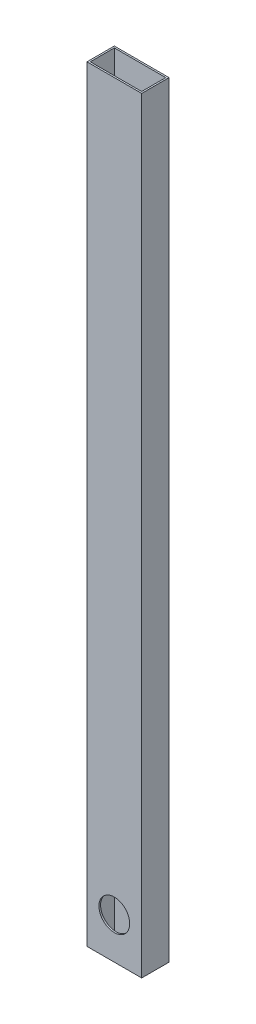
ISO-10303-21;
HEADER;
FILE_DESCRIPTION(('STEP AP214'),'2;1');
FILE_NAME('part.step','',(''),(''),'','','');
FILE_SCHEMA(('AUTOMOTIVE_DESIGN { 1 0 10303 214 1 1 1 1 }'));
ENDSEC;
DATA;
#1=APPLICATION_CONTEXT('core data for automotive mechanical design processes');
#2=APPLICATION_PROTOCOL_DEFINITION('international standard','automotive_design',2000,#1);
#3=PRODUCT_CONTEXT('',#1,'mechanical');
#4=PRODUCT('Part','Part','',(#3));
#5=PRODUCT_RELATED_PRODUCT_CATEGORY('part','',(#4));
#6=PRODUCT_DEFINITION_FORMATION('','',#4);
#7=PRODUCT_DEFINITION_CONTEXT('part definition',#1,'design');
#8=PRODUCT_DEFINITION('design','',#6,#7);
#9=PRODUCT_DEFINITION_SHAPE('','',#8);
#10=(LENGTH_UNIT() NAMED_UNIT(*) SI_UNIT(.MILLI.,.METRE.));
#11=(NAMED_UNIT(*) PLANE_ANGLE_UNIT() SI_UNIT($,.RADIAN.));
#12=(NAMED_UNIT(*) SI_UNIT($,.STERADIAN.) SOLID_ANGLE_UNIT());
#13=UNCERTAINTY_MEASURE_WITH_UNIT(LENGTH_MEASURE(1.E-05),#10,'distance_accuracy_value','');
#14=(GEOMETRIC_REPRESENTATION_CONTEXT(3) GLOBAL_UNCERTAINTY_ASSIGNED_CONTEXT((#13)) GLOBAL_UNIT_ASSIGNED_CONTEXT((#10,
#11,#12)) REPRESENTATION_CONTEXT('',''));
#15=CARTESIAN_POINT('',(0.,0.,0.));
#16=DIRECTION('',(0.,0.,1.));
#17=DIRECTION('',(1.,0.,0.));
#18=AXIS2_PLACEMENT_3D('',#15,#16,#17);
#19=CARTESIAN_POINT('',(0.,711.2,0.));
#20=DIRECTION('',(0.,1.,0.));
#21=DIRECTION('',(0.,0.,1.));
#22=AXIS2_PLACEMENT_3D('',#19,#20,#21);
#23=PLANE('',#22);
#24=DIRECTION('',(0.,0.,-1.));
#25=VECTOR('',#24,1.);
#26=CARTESIAN_POINT('',(0.,711.2,0.));
#27=LINE('',#26,#25);
#28=CARTESIAN_POINT('',(0.,711.2,25.4));
#29=VERTEX_POINT('',#28);
#30=CARTESIAN_POINT('',(0.,711.2,0.));
#31=VERTEX_POINT('',#30);
#32=EDGE_CURVE('E180',#29,#31,#27,.T.);
#33=ORIENTED_EDGE('',*,*,#32,.T.);
#34=DIRECTION('',(-1.,0.,0.));
#35=VECTOR('',#34,1.);
#36=CARTESIAN_POINT('',(0.,711.2,0.));
#37=LINE('',#36,#35);
#38=CARTESIAN_POINT('',(-50.8,711.2,0.));
#39=VERTEX_POINT('',#38);
#40=EDGE_CURVE('E184',#31,#39,#37,.T.);
#41=ORIENTED_EDGE('',*,*,#40,.T.);
#42=DIRECTION('',(0.,0.,1.));
#43=VECTOR('',#42,1.);
#44=CARTESIAN_POINT('',(-50.8,711.2,0.));
#45=LINE('',#44,#43);
#46=CARTESIAN_POINT('',(-50.8,711.2,25.4));
#47=VERTEX_POINT('',#46);
#48=EDGE_CURVE('E188',#39,#47,#45,.T.);
#49=ORIENTED_EDGE('',*,*,#48,.T.);
#50=DIRECTION('',(1.,0.,0.));
#51=VECTOR('',#50,1.);
#52=CARTESIAN_POINT('',(0.,711.2,25.4));
#53=LINE('',#52,#51);
#54=EDGE_CURVE('E191',#47,#29,#53,.T.);
#55=ORIENTED_EDGE('',*,*,#54,.T.);
#56=EDGE_LOOP('',(#33,#41,#49,#55));
#57=FACE_BOUND('',#56,.T.);
#58=DIRECTION('',(-1.,0.,0.));
#59=VECTOR('',#58,1.);
#60=CARTESIAN_POINT('',(0.,711.2,1.524));
#61=LINE('',#60,#59);
#62=CARTESIAN_POINT('',(-1.524,711.2,1.524));
#63=VERTEX_POINT('',#62);
#64=CARTESIAN_POINT('',(-49.276,711.2,1.524));
#65=VERTEX_POINT('',#64);
#66=EDGE_CURVE('E139',#63,#65,#61,.T.);
#67=ORIENTED_EDGE('',*,*,#66,.F.);
#68=DIRECTION('',(0.,0.,-1.));
#69=VECTOR('',#68,1.);
#70=CARTESIAN_POINT('',(-1.524,711.2,0.));
#71=LINE('',#70,#69);
#72=CARTESIAN_POINT('',(-1.524,711.2,23.876));
#73=VERTEX_POINT('',#72);
#74=EDGE_CURVE('E130',#73,#63,#71,.T.);
#75=ORIENTED_EDGE('',*,*,#74,.F.);
#76=DIRECTION('',(1.,0.,0.));
#77=VECTOR('',#76,1.);
#78=CARTESIAN_POINT('',(0.,711.2,23.876));
#79=LINE('',#78,#77);
#80=CARTESIAN_POINT('',(-49.276,711.2,23.876));
#81=VERTEX_POINT('',#80);
#82=EDGE_CURVE('E156',#81,#73,#79,.T.);
#83=ORIENTED_EDGE('',*,*,#82,.F.);
#84=DIRECTION('',(0.,0.,1.));
#85=VECTOR('',#84,1.);
#86=CARTESIAN_POINT('',(-49.276,711.2,0.));
#87=LINE('',#86,#85);
#88=EDGE_CURVE('E152',#65,#81,#87,.T.);
#89=ORIENTED_EDGE('',*,*,#88,.F.);
#90=EDGE_LOOP('',(#67,#75,#83,#89));
#91=FACE_BOUND('',#90,.T.);
#92=ADVANCED_FACE('F63',(#57,#91),#23,.T.);
#93=CARTESIAN_POINT('',(0.,0.,0.));
#94=DIRECTION('',(0.,1.,0.));
#95=DIRECTION('',(0.,0.,1.));
#96=AXIS2_PLACEMENT_3D('',#93,#94,#95);
#97=PLANE('',#96);
#98=DIRECTION('',(0.,0.,-1.));
#99=VECTOR('',#98,1.);
#100=CARTESIAN_POINT('',(0.,0.,0.));
#101=LINE('',#100,#99);
#102=CARTESIAN_POINT('',(0.,0.,25.4));
#103=VERTEX_POINT('',#102);
#104=CARTESIAN_POINT('',(0.,0.,0.));
#105=VERTEX_POINT('',#104);
#106=EDGE_CURVE('E148',#103,#105,#101,.T.);
#107=ORIENTED_EDGE('',*,*,#106,.F.);
#108=DIRECTION('',(1.,0.,0.));
#109=VECTOR('',#108,1.);
#110=CARTESIAN_POINT('',(0.,0.,25.4));
#111=LINE('',#110,#109);
#112=CARTESIAN_POINT('',(-50.8,0.,25.4));
#113=VERTEX_POINT('',#112);
#114=EDGE_CURVE('E185',#113,#103,#111,.T.);
#115=ORIENTED_EDGE('',*,*,#114,.F.);
#116=DIRECTION('',(0.,0.,1.));
#117=VECTOR('',#116,1.);
#118=CARTESIAN_POINT('',(-50.8,0.,0.));
#119=LINE('',#118,#117);
#120=CARTESIAN_POINT('',(-50.8,0.,0.));
#121=VERTEX_POINT('',#120);
#122=EDGE_CURVE('E201',#121,#113,#119,.T.);
#123=ORIENTED_EDGE('',*,*,#122,.F.);
#124=DIRECTION('',(-1.,0.,0.));
#125=VECTOR('',#124,1.);
#126=CARTESIAN_POINT('',(0.,0.,0.));
#127=LINE('',#126,#125);
#128=EDGE_CURVE('E198',#105,#121,#127,.T.);
#129=ORIENTED_EDGE('',*,*,#128,.F.);
#130=EDGE_LOOP('',(#107,#115,#123,#129));
#131=FACE_BOUND('',#130,.T.);
#132=DIRECTION('',(0.,0.,-1.));
#133=VECTOR('',#132,1.);
#134=CARTESIAN_POINT('',(-1.524,0.,0.));
#135=LINE('',#134,#133);
#136=CARTESIAN_POINT('',(-1.524,0.,23.876));
#137=VERTEX_POINT('',#136);
#138=CARTESIAN_POINT('',(-1.524,0.,1.524));
#139=VERTEX_POINT('',#138);
#140=EDGE_CURVE('E88',#137,#139,#135,.T.);
#141=ORIENTED_EDGE('',*,*,#140,.T.);
#142=DIRECTION('',(-1.,0.,0.));
#143=VECTOR('',#142,1.);
#144=CARTESIAN_POINT('',(0.,0.,1.524));
#145=LINE('',#144,#143);
#146=CARTESIAN_POINT('',(-49.276,0.,1.524));
#147=VERTEX_POINT('',#146);
#148=EDGE_CURVE('E146',#139,#147,#145,.T.);
#149=ORIENTED_EDGE('',*,*,#148,.T.);
#150=DIRECTION('',(0.,0.,1.));
#151=VECTOR('',#150,1.);
#152=CARTESIAN_POINT('',(-49.276,0.,0.));
#153=LINE('',#152,#151);
#154=CARTESIAN_POINT('',(-49.276,0.,23.876));
#155=VERTEX_POINT('',#154);
#156=EDGE_CURVE('E167',#147,#155,#153,.T.);
#157=ORIENTED_EDGE('',*,*,#156,.T.);
#158=DIRECTION('',(1.,0.,0.));
#159=VECTOR('',#158,1.);
#160=CARTESIAN_POINT('',(0.,0.,23.876));
#161=LINE('',#160,#159);
#162=EDGE_CURVE('E140',#155,#137,#161,.T.);
#163=ORIENTED_EDGE('',*,*,#162,.T.);
#164=EDGE_LOOP('',(#141,#149,#157,#163));
#165=FACE_BOUND('',#164,.T.);
#166=ADVANCED_FACE('F225',(#131,#165),#97,.F.);
#167=CARTESIAN_POINT('',(0.,711.2,0.));
#168=DIRECTION('',(-1.,0.,0.));
#169=DIRECTION('',(0.,0.,1.));
#170=AXIS2_PLACEMENT_3D('',#167,#168,#169);
#171=PLANE('',#170);
#172=ORIENTED_EDGE('',*,*,#106,.T.);
#173=DIRECTION('',(0.,-1.,0.));
#174=VECTOR('',#173,1.);
#175=CARTESIAN_POINT('',(0.,711.2,0.));
#176=LINE('',#175,#174);
#177=EDGE_CURVE('E12',#31,#105,#176,.T.);
#178=ORIENTED_EDGE('',*,*,#177,.F.);
#179=ORIENTED_EDGE('',*,*,#32,.F.);
#180=DIRECTION('',(0.,-1.,0.));
#181=VECTOR('',#180,1.);
#182=CARTESIAN_POINT('',(0.,711.2,25.4));
#183=LINE('',#182,#181);
#184=EDGE_CURVE('E194',#29,#103,#183,.T.);
#185=ORIENTED_EDGE('',*,*,#184,.T.);
#186=EDGE_LOOP('',(#172,#178,#179,#185));
#187=FACE_BOUND('',#186,.T.);
#188=ADVANCED_FACE('F65',(#187),#171,.F.);
#189=CARTESIAN_POINT('',(0.,711.2,0.));
#190=DIRECTION('',(0.,0.,1.));
#191=DIRECTION('',(1.,0.,0.));
#192=AXIS2_PLACEMENT_3D('',#189,#190,#191);
#193=PLANE('',#192);
#194=CARTESIAN_POINT('',(-25.4,38.1,0.));
#195=DIRECTION('',(0.,0.,1.));
#196=DIRECTION('',(1.,0.,0.));
#197=AXIS2_PLACEMENT_3D('',#194,#195,#196);
#198=CIRCLE('',#197,14.2875);
#199=CARTESIAN_POINT('',(-11.1125,38.1,0.));
#200=VERTEX_POINT('',#199);
#201=EDGE_CURVE('E267',#200,#200,#198,.T.);
#202=ORIENTED_EDGE('',*,*,#201,.T.);
#203=EDGE_LOOP('',(#202));
#204=FACE_BOUND('',#203,.T.);
#205=ORIENTED_EDGE('',*,*,#128,.T.);
#206=DIRECTION('',(0.,-1.,0.));
#207=VECTOR('',#206,1.);
#208=CARTESIAN_POINT('',(-50.8,711.2,0.));
#209=LINE('',#208,#207);
#210=EDGE_CURVE('E73',#39,#121,#209,.T.);
#211=ORIENTED_EDGE('',*,*,#210,.F.);
#212=ORIENTED_EDGE('',*,*,#40,.F.);
#213=ORIENTED_EDGE('',*,*,#177,.T.);
#214=EDGE_LOOP('',(#205,#211,#212,#213));
#215=FACE_BOUND('',#214,.T.);
#216=ADVANCED_FACE('F235',(#204,#215),#193,.F.);
#217=CARTESIAN_POINT('',(-50.8,711.2,0.));
#218=DIRECTION('',(1.,0.,0.));
#219=DIRECTION('',(0.,0.,-1.));
#220=AXIS2_PLACEMENT_3D('',#217,#218,#219);
#221=PLANE('',#220);
#222=ORIENTED_EDGE('',*,*,#122,.T.);
#223=DIRECTION('',(0.,-1.,0.));
#224=VECTOR('',#223,1.);
#225=CARTESIAN_POINT('',(-50.8,711.2,25.4));
#226=LINE('',#225,#224);
#227=EDGE_CURVE('E209',#47,#113,#226,.T.);
#228=ORIENTED_EDGE('',*,*,#227,.F.);
#229=ORIENTED_EDGE('',*,*,#48,.F.);
#230=ORIENTED_EDGE('',*,*,#210,.T.);
#231=EDGE_LOOP('',(#222,#228,#229,#230));
#232=FACE_BOUND('',#231,.T.);
#233=ADVANCED_FACE('F219',(#232),#221,.F.);
#234=CARTESIAN_POINT('',(0.,711.2,25.4));
#235=DIRECTION('',(0.,0.,-1.));
#236=DIRECTION('',(-1.,0.,0.));
#237=AXIS2_PLACEMENT_3D('',#234,#235,#236);
#238=PLANE('',#237);
#239=CARTESIAN_POINT('',(-25.4,38.1,25.4));
#240=DIRECTION('',(0.,0.,-1.));
#241=DIRECTION('',(-1.,0.,0.));
#242=AXIS2_PLACEMENT_3D('',#239,#240,#241);
#243=CIRCLE('',#242,14.2875);
#244=CARTESIAN_POINT('',(-39.6875,38.1,25.4));
#245=VERTEX_POINT('',#244);
#246=EDGE_CURVE('E164',#245,#245,#243,.T.);
#247=ORIENTED_EDGE('',*,*,#246,.T.);
#248=EDGE_LOOP('',(#247));
#249=FACE_BOUND('',#248,.T.);
#250=ORIENTED_EDGE('',*,*,#114,.T.);
#251=ORIENTED_EDGE('',*,*,#184,.F.);
#252=ORIENTED_EDGE('',*,*,#54,.F.);
#253=ORIENTED_EDGE('',*,*,#227,.T.);
#254=EDGE_LOOP('',(#250,#251,#252,#253));
#255=FACE_BOUND('',#254,.T.);
#256=ADVANCED_FACE('F229',(#249,#255),#238,.F.);
#257=CARTESIAN_POINT('',(-1.524,711.2,0.));
#258=DIRECTION('',(-1.,0.,0.));
#259=DIRECTION('',(0.,0.,1.));
#260=AXIS2_PLACEMENT_3D('',#257,#258,#259);
#261=PLANE('',#260);
#262=ORIENTED_EDGE('',*,*,#140,.F.);
#263=DIRECTION('',(0.,-1.,0.));
#264=VECTOR('',#263,1.);
#265=CARTESIAN_POINT('',(-1.524,711.2,23.876));
#266=LINE('',#265,#264);
#267=EDGE_CURVE('E134',#73,#137,#266,.T.);
#268=ORIENTED_EDGE('',*,*,#267,.F.);
#269=ORIENTED_EDGE('',*,*,#74,.T.);
#270=DIRECTION('',(0.,-1.,0.));
#271=VECTOR('',#270,1.);
#272=CARTESIAN_POINT('',(-1.524,711.2,1.524));
#273=LINE('',#272,#271);
#274=EDGE_CURVE('E133',#63,#139,#273,.T.);
#275=ORIENTED_EDGE('',*,*,#274,.T.);
#276=EDGE_LOOP('',(#262,#268,#269,#275));
#277=FACE_BOUND('',#276,.T.);
#278=ADVANCED_FACE('F132',(#277),#261,.T.);
#279=CARTESIAN_POINT('',(0.,711.2,1.524));
#280=DIRECTION('',(0.,0.,1.));
#281=DIRECTION('',(1.,0.,0.));
#282=AXIS2_PLACEMENT_3D('',#279,#280,#281);
#283=PLANE('',#282);
#284=CARTESIAN_POINT('',(-25.4,38.1,1.524));
#285=DIRECTION('',(0.,0.,1.));
#286=DIRECTION('',(1.,0.,0.));
#287=AXIS2_PLACEMENT_3D('',#284,#285,#286);
#288=CIRCLE('',#287,14.2875);
#289=CARTESIAN_POINT('',(-11.1125,38.1,1.524));
#290=VERTEX_POINT('',#289);
#291=EDGE_CURVE('E262',#290,#290,#288,.T.);
#292=ORIENTED_EDGE('',*,*,#291,.F.);
#293=EDGE_LOOP('',(#292));
#294=FACE_BOUND('',#293,.T.);
#295=ORIENTED_EDGE('',*,*,#148,.F.);
#296=ORIENTED_EDGE('',*,*,#274,.F.);
#297=ORIENTED_EDGE('',*,*,#66,.T.);
#298=DIRECTION('',(0.,-1.,0.));
#299=VECTOR('',#298,1.);
#300=CARTESIAN_POINT('',(-49.276,711.2,1.524));
#301=LINE('',#300,#299);
#302=EDGE_CURVE('E149',#65,#147,#301,.T.);
#303=ORIENTED_EDGE('',*,*,#302,.T.);
#304=EDGE_LOOP('',(#295,#296,#297,#303));
#305=FACE_BOUND('',#304,.T.);
#306=ADVANCED_FACE('F143',(#294,#305),#283,.T.);
#307=CARTESIAN_POINT('',(-49.276,711.2,0.));
#308=DIRECTION('',(1.,0.,0.));
#309=DIRECTION('',(0.,0.,-1.));
#310=AXIS2_PLACEMENT_3D('',#307,#308,#309);
#311=PLANE('',#310);
#312=ORIENTED_EDGE('',*,*,#156,.F.);
#313=ORIENTED_EDGE('',*,*,#302,.F.);
#314=ORIENTED_EDGE('',*,*,#88,.T.);
#315=DIRECTION('',(0.,-1.,0.));
#316=VECTOR('',#315,1.);
#317=CARTESIAN_POINT('',(-49.276,711.2,23.876));
#318=LINE('',#317,#316);
#319=EDGE_CURVE('E80',#81,#155,#318,.T.);
#320=ORIENTED_EDGE('',*,*,#319,.T.);
#321=EDGE_LOOP('',(#312,#313,#314,#320));
#322=FACE_BOUND('',#321,.T.);
#323=ADVANCED_FACE('F278',(#322),#311,.T.);
#324=CARTESIAN_POINT('',(0.,711.2,23.876));
#325=DIRECTION('',(0.,0.,-1.));
#326=DIRECTION('',(-1.,0.,0.));
#327=AXIS2_PLACEMENT_3D('',#324,#325,#326);
#328=PLANE('',#327);
#329=CARTESIAN_POINT('',(-25.4,38.1,23.876));
#330=DIRECTION('',(0.,0.,-1.));
#331=DIRECTION('',(-1.,0.,0.));
#332=AXIS2_PLACEMENT_3D('',#329,#330,#331);
#333=CIRCLE('',#332,14.2875);
#334=CARTESIAN_POINT('',(-39.6875,38.1,23.876));
#335=VERTEX_POINT('',#334);
#336=EDGE_CURVE('E67',#335,#335,#333,.T.);
#337=ORIENTED_EDGE('',*,*,#336,.F.);
#338=EDGE_LOOP('',(#337));
#339=FACE_BOUND('',#338,.T.);
#340=ORIENTED_EDGE('',*,*,#162,.F.);
#341=ORIENTED_EDGE('',*,*,#319,.F.);
#342=ORIENTED_EDGE('',*,*,#82,.T.);
#343=ORIENTED_EDGE('',*,*,#267,.T.);
#344=EDGE_LOOP('',(#340,#341,#342,#343));
#345=FACE_BOUND('',#344,.T.);
#346=ADVANCED_FACE('F276',(#339,#345),#328,.T.);
#347=CARTESIAN_POINT('',(-25.4,38.1,0.));
#348=DIRECTION('',(0.,0.,1.));
#349=DIRECTION('',(1.,0.,0.));
#350=AXIS2_PLACEMENT_3D('',#347,#348,#349);
#351=CYLINDRICAL_SURFACE('',#350,14.2875);
#352=ORIENTED_EDGE('',*,*,#336,.T.);
#353=EDGE_LOOP('',(#352));
#354=FACE_BOUND('',#353,.T.);
#355=ORIENTED_EDGE('',*,*,#246,.F.);
#356=EDGE_LOOP('',(#355));
#357=FACE_BOUND('',#356,.T.);
#358=ADVANCED_FACE('F274',(#354,#357),#351,.F.);
#359=ORIENTED_EDGE('',*,*,#291,.T.);
#360=EDGE_LOOP('',(#359));
#361=FACE_BOUND('',#360,.T.);
#362=ORIENTED_EDGE('',*,*,#201,.F.);
#363=EDGE_LOOP('',(#362));
#364=FACE_BOUND('',#363,.T.);
#365=ADVANCED_FACE('F290',(#361,#364),#351,.F.);
#366=CLOSED_SHELL('',(#92,#166,#188,#216,#233,#256,#278,#306,#323,#346,#358,#365));
#367=MANIFOLD_SOLID_BREP('B2',#366);
#368=ADVANCED_BREP_SHAPE_REPRESENTATION('',(#18,#367),#14);
#369=SHAPE_DEFINITION_REPRESENTATION(#9,#368);
ENDSEC;
END-ISO-10303-21;
